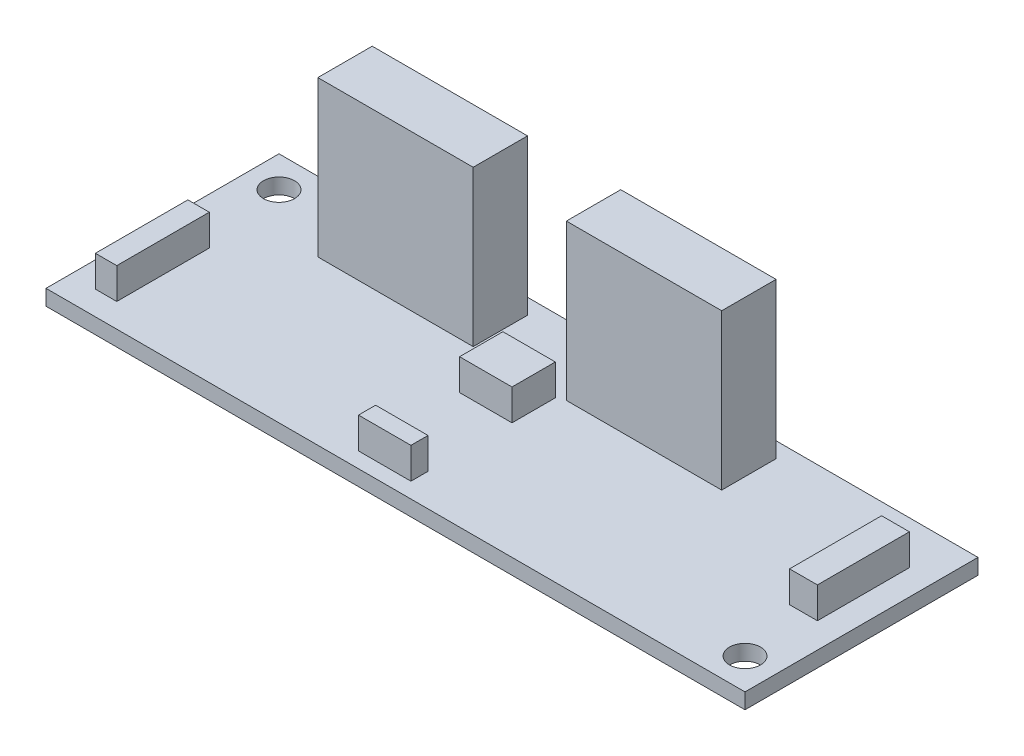
ISO-10303-21;
HEADER;
FILE_DESCRIPTION(('STEP AP214'),'2;1');
FILE_NAME('part.step','',(''),(''),'','','');
FILE_SCHEMA(('AUTOMOTIVE_DESIGN { 1 0 10303 214 1 1 1 1 }'));
ENDSEC;
DATA;
#1=APPLICATION_CONTEXT('core data for automotive mechanical design processes');
#2=APPLICATION_PROTOCOL_DEFINITION('international standard','automotive_design',2000,#1);
#3=PRODUCT_CONTEXT('',#1,'mechanical');
#4=PRODUCT('Part','Part','',(#3));
#5=PRODUCT_RELATED_PRODUCT_CATEGORY('part','',(#4));
#6=PRODUCT_DEFINITION_FORMATION('','',#4);
#7=PRODUCT_DEFINITION_CONTEXT('part definition',#1,'design');
#8=PRODUCT_DEFINITION('design','',#6,#7);
#9=PRODUCT_DEFINITION_SHAPE('','',#8);
#10=(LENGTH_UNIT() NAMED_UNIT(*) SI_UNIT(.MILLI.,.METRE.));
#11=(NAMED_UNIT(*) PLANE_ANGLE_UNIT() SI_UNIT($,.RADIAN.));
#12=(NAMED_UNIT(*) SI_UNIT($,.STERADIAN.) SOLID_ANGLE_UNIT());
#13=UNCERTAINTY_MEASURE_WITH_UNIT(LENGTH_MEASURE(1.E-05),#10,'distance_accuracy_value','');
#14=(GEOMETRIC_REPRESENTATION_CONTEXT(3) GLOBAL_UNCERTAINTY_ASSIGNED_CONTEXT((#13)) GLOBAL_UNIT_ASSIGNED_CONTEXT((#10,
#11,#12)) REPRESENTATION_CONTEXT('',''));
#15=CARTESIAN_POINT('',(0.,0.,0.));
#16=DIRECTION('',(0.,0.,1.));
#17=DIRECTION('',(1.,0.,0.));
#18=AXIS2_PLACEMENT_3D('',#15,#16,#17);
#19=CARTESIAN_POINT('',(0.,0.5,0.));
#20=DIRECTION('',(0.,-1.,0.));
#21=DIRECTION('',(0.,0.,-1.));
#22=AXIS2_PLACEMENT_3D('',#19,#20,#21);
#23=PLANE('',#22);
#24=DIRECTION('',(0.,0.,1.));
#25=VECTOR('',#24,1.);
#26=CARTESIAN_POINT('',(-3.37429043222979,0.5,5.40575099857224));
#27=LINE('',#26,#25);
#28=CARTESIAN_POINT('',(-3.37429043222979,0.5,5.40575099857224));
#29=VERTEX_POINT('',#28);
#30=CARTESIAN_POINT('',(-3.37429043222979,0.5,6.50756011930034));
#31=VERTEX_POINT('',#30);
#32=EDGE_CURVE('E238',#29,#31,#27,.T.);
#33=ORIENTED_EDGE('',*,*,#32,.F.);
#34=DIRECTION('',(-1.,0.,0.));
#35=VECTOR('',#34,1.);
#36=CARTESIAN_POINT('',(-3.37429043222979,0.5,5.40575099857224));
#37=LINE('',#36,#35);
#38=CARTESIAN_POINT('',(0.,0.5,5.40575099857224));
#39=VERTEX_POINT('',#38);
#40=EDGE_CURVE('E251',#39,#29,#37,.T.);
#41=ORIENTED_EDGE('',*,*,#40,.F.);
#42=DIRECTION('',(0.,0.,-1.));
#43=VECTOR('',#42,1.);
#44=CARTESIAN_POINT('',(0.,0.5,5.40575099857224));
#45=LINE('',#44,#43);
#46=CARTESIAN_POINT('',(0.,0.5,6.50756011930034));
#47=VERTEX_POINT('',#46);
#48=EDGE_CURVE('E260',#47,#39,#45,.T.);
#49=ORIENTED_EDGE('',*,*,#48,.F.);
#50=DIRECTION('',(1.,0.,0.));
#51=VECTOR('',#50,1.);
#52=CARTESIAN_POINT('',(-3.37429043222979,0.5,6.50756011930034));
#53=LINE('',#52,#51);
#54=EDGE_CURVE('E241',#31,#47,#53,.T.);
#55=ORIENTED_EDGE('',*,*,#54,.F.);
#56=EDGE_LOOP('',(#33,#41,#49,#55));
#57=FACE_BOUND('',#56,.T.);
#58=DIRECTION('',(0.,0.,1.));
#59=VECTOR('',#58,1.);
#60=CARTESIAN_POINT('',(-3.37429043222979,0.5,-2.78895433684296));
#61=LINE('',#60,#59);
#62=CARTESIAN_POINT('',(-3.37429043222979,0.5,-2.78895433684296));
#63=VERTEX_POINT('',#62);
#64=CARTESIAN_POINT('',(-3.37429043222979,0.5,0.));
#65=VERTEX_POINT('',#64);
#66=EDGE_CURVE('E309',#63,#65,#61,.T.);
#67=ORIENTED_EDGE('',*,*,#66,.F.);
#68=DIRECTION('',(-1.,0.,0.));
#69=VECTOR('',#68,1.);
#70=CARTESIAN_POINT('',(-3.37429043222979,0.5,-2.78895433684296));
#71=LINE('',#70,#69);
#72=CARTESIAN_POINT('',(0.,0.5,-2.78895433684296));
#73=VERTEX_POINT('',#72);
#74=EDGE_CURVE('E314',#73,#63,#71,.T.);
#75=ORIENTED_EDGE('',*,*,#74,.F.);
#76=DIRECTION('',(0.,0.,-1.));
#77=VECTOR('',#76,1.);
#78=CARTESIAN_POINT('',(0.,0.5,-2.78895433684296));
#79=LINE('',#78,#77);
#80=CARTESIAN_POINT('',(0.,0.5,0.));
#81=VERTEX_POINT('',#80);
#82=EDGE_CURVE('E326',#81,#73,#79,.T.);
#83=ORIENTED_EDGE('',*,*,#82,.F.);
#84=DIRECTION('',(1.,0.,0.));
#85=VECTOR('',#84,1.);
#86=CARTESIAN_POINT('',(-3.37429043222979,0.5,0.));
#87=LINE('',#86,#85);
#88=EDGE_CURVE('E323',#65,#81,#87,.T.);
#89=ORIENTED_EDGE('',*,*,#88,.F.);
#90=EDGE_LOOP('',(#67,#75,#83,#89));
#91=FACE_BOUND('',#90,.T.);
#92=DIRECTION('',(0.,0.,1.));
#93=VECTOR('',#92,1.);
#94=CARTESIAN_POINT('',(-15.5,0.5,-6.5));
#95=LINE('',#94,#93);
#96=CARTESIAN_POINT('',(-15.5,0.5,-6.5));
#97=VERTEX_POINT('',#96);
#98=CARTESIAN_POINT('',(-15.5,0.5,-3.));
#99=VERTEX_POINT('',#98);
#100=EDGE_CURVE('E375',#97,#99,#95,.T.);
#101=ORIENTED_EDGE('',*,*,#100,.F.);
#102=DIRECTION('',(-1.,0.,0.));
#103=VECTOR('',#102,1.);
#104=CARTESIAN_POINT('',(-15.5,0.5,-6.5));
#105=LINE('',#104,#103);
#106=CARTESIAN_POINT('',(-5.5,0.5,-6.5));
#107=VERTEX_POINT('',#106);
#108=EDGE_CURVE('E380',#107,#97,#105,.T.);
#109=ORIENTED_EDGE('',*,*,#108,.F.);
#110=DIRECTION('',(0.,0.,-1.));
#111=VECTOR('',#110,1.);
#112=CARTESIAN_POINT('',(-5.5,0.5,-6.5));
#113=LINE('',#112,#111);
#114=CARTESIAN_POINT('',(-5.5,0.5,-3.));
#115=VERTEX_POINT('',#114);
#116=EDGE_CURVE('E392',#115,#107,#113,.T.);
#117=ORIENTED_EDGE('',*,*,#116,.F.);
#118=DIRECTION('',(1.,0.,0.));
#119=VECTOR('',#118,1.);
#120=CARTESIAN_POINT('',(-15.5,0.5,-3.));
#121=LINE('',#120,#119);
#122=EDGE_CURVE('E389',#99,#115,#121,.T.);
#123=ORIENTED_EDGE('',*,*,#122,.F.);
#124=EDGE_LOOP('',(#101,#109,#117,#123));
#125=FACE_BOUND('',#124,.T.);
#126=DIRECTION('',(0.,0.,-1.));
#127=VECTOR('',#126,1.);
#128=CARTESIAN_POINT('',(22.5,0.5,7.5));
#129=LINE('',#128,#127);
#130=CARTESIAN_POINT('',(22.5,0.5,7.5));
#131=VERTEX_POINT('',#130);
#132=CARTESIAN_POINT('',(22.5,0.5,-7.5));
#133=VERTEX_POINT('',#132);
#134=EDGE_CURVE('E421',#131,#133,#129,.T.);
#135=ORIENTED_EDGE('',*,*,#134,.T.);
#136=DIRECTION('',(-1.,0.,0.));
#137=VECTOR('',#136,1.);
#138=CARTESIAN_POINT('',(-22.5,0.5,-7.5));
#139=LINE('',#138,#137);
#140=CARTESIAN_POINT('',(-22.5,0.5,-7.5));
#141=VERTEX_POINT('',#140);
#142=EDGE_CURVE('E424',#133,#141,#139,.T.);
#143=ORIENTED_EDGE('',*,*,#142,.T.);
#144=DIRECTION('',(0.,0.,1.));
#145=VECTOR('',#144,1.);
#146=CARTESIAN_POINT('',(-22.5,0.5,7.5));
#147=LINE('',#146,#145);
#148=CARTESIAN_POINT('',(-22.5,0.5,7.5));
#149=VERTEX_POINT('',#148);
#150=EDGE_CURVE('E427',#141,#149,#147,.T.);
#151=ORIENTED_EDGE('',*,*,#150,.T.);
#152=DIRECTION('',(1.,0.,0.));
#153=VECTOR('',#152,1.);
#154=CARTESIAN_POINT('',(-22.5,0.5,7.5));
#155=LINE('',#154,#153);
#156=EDGE_CURVE('E429',#149,#131,#155,.T.);
#157=ORIENTED_EDGE('',*,*,#156,.T.);
#158=EDGE_LOOP('',(#135,#143,#151,#157));
#159=FACE_BOUND('',#158,.T.);
#160=CARTESIAN_POINT('',(-20.5,0.5,-5.5));
#161=DIRECTION('',(0.,1.,0.));
#162=DIRECTION('',(0.,0.,1.));
#163=AXIS2_PLACEMENT_3D('',#160,#161,#162);
#164=CIRCLE('',#163,1.);
#165=CARTESIAN_POINT('',(-20.5,0.5,-4.5));
#166=VERTEX_POINT('',#165);
#167=EDGE_CURVE('E415',#166,#166,#164,.T.);
#168=ORIENTED_EDGE('',*,*,#167,.F.);
#169=EDGE_LOOP('',(#168));
#170=FACE_BOUND('',#169,.T.);
#171=CARTESIAN_POINT('',(20.5,0.5,5.5));
#172=DIRECTION('',(0.,1.,0.));
#173=DIRECTION('',(0.,0.,1.));
#174=AXIS2_PLACEMENT_3D('',#171,#172,#173);
#175=CIRCLE('',#174,1.);
#176=CARTESIAN_POINT('',(20.5,0.5,6.5));
#177=VERTEX_POINT('',#176);
#178=EDGE_CURVE('E409',#177,#177,#175,.T.);
#179=ORIENTED_EDGE('',*,*,#178,.F.);
#180=EDGE_LOOP('',(#179));
#181=FACE_BOUND('',#180,.T.);
#182=DIRECTION('',(0.,0.,1.));
#183=VECTOR('',#182,1.);
#184=CARTESIAN_POINT('',(0.500000000000004,0.5,-6.5));
#185=LINE('',#184,#183);
#186=CARTESIAN_POINT('',(0.500000000000004,0.5,-6.5));
#187=VERTEX_POINT('',#186);
#188=CARTESIAN_POINT('',(0.500000000000004,0.5,-3.));
#189=VERTEX_POINT('',#188);
#190=EDGE_CURVE('E342',#187,#189,#185,.T.);
#191=ORIENTED_EDGE('',*,*,#190,.F.);
#192=DIRECTION('',(-1.,0.,0.));
#193=VECTOR('',#192,1.);
#194=CARTESIAN_POINT('',(0.500000000000004,0.5,-6.5));
#195=LINE('',#194,#193);
#196=CARTESIAN_POINT('',(10.5,0.5,-6.5));
#197=VERTEX_POINT('',#196);
#198=EDGE_CURVE('E347',#197,#187,#195,.T.);
#199=ORIENTED_EDGE('',*,*,#198,.F.);
#200=DIRECTION('',(0.,0.,-1.));
#201=VECTOR('',#200,1.);
#202=CARTESIAN_POINT('',(10.5,0.5,-6.5));
#203=LINE('',#202,#201);
#204=CARTESIAN_POINT('',(10.5,0.5,-3.));
#205=VERTEX_POINT('',#204);
#206=EDGE_CURVE('E359',#205,#197,#203,.T.);
#207=ORIENTED_EDGE('',*,*,#206,.F.);
#208=DIRECTION('',(1.,0.,0.));
#209=VECTOR('',#208,1.);
#210=CARTESIAN_POINT('',(0.500000000000004,0.5,-3.));
#211=LINE('',#210,#209);
#212=EDGE_CURVE('E356',#189,#205,#211,.T.);
#213=ORIENTED_EDGE('',*,*,#212,.F.);
#214=EDGE_LOOP('',(#191,#199,#207,#213));
#215=FACE_BOUND('',#214,.T.);
#216=DIRECTION('',(0.,0.,1.));
#217=VECTOR('',#216,1.);
#218=CARTESIAN_POINT('',(-20.8655102237883,0.5,0.));
#219=LINE('',#218,#217);
#220=CARTESIAN_POINT('',(-20.8655102237883,0.5,0.));
#221=VERTEX_POINT('',#220);
#222=CARTESIAN_POINT('',(-20.8655102237883,0.5,5.95665555893629));
#223=VERTEX_POINT('',#222);
#224=EDGE_CURVE('E276',#221,#223,#219,.T.);
#225=ORIENTED_EDGE('',*,*,#224,.F.);
#226=DIRECTION('',(-1.,0.,0.));
#227=VECTOR('',#226,1.);
#228=CARTESIAN_POINT('',(-20.8655102237883,0.5,0.));
#229=LINE('',#228,#227);
#230=CARTESIAN_POINT('',(-19.4882488228782,0.5,0.));
#231=VERTEX_POINT('',#230);
#232=EDGE_CURVE('E281',#231,#221,#229,.T.);
#233=ORIENTED_EDGE('',*,*,#232,.F.);
#234=DIRECTION('',(0.,0.,-1.));
#235=VECTOR('',#234,1.);
#236=CARTESIAN_POINT('',(-19.4882488228782,0.5,0.));
#237=LINE('',#236,#235);
#238=CARTESIAN_POINT('',(-19.4882488228782,0.5,5.95665555893629));
#239=VERTEX_POINT('',#238);
#240=EDGE_CURVE('E293',#239,#231,#237,.T.);
#241=ORIENTED_EDGE('',*,*,#240,.F.);
#242=DIRECTION('',(1.,0.,0.));
#243=VECTOR('',#242,1.);
#244=CARTESIAN_POINT('',(-20.8655102237883,0.5,5.95665555893629));
#245=LINE('',#244,#243);
#246=EDGE_CURVE('E290',#223,#239,#245,.T.);
#247=ORIENTED_EDGE('',*,*,#246,.F.);
#248=EDGE_LOOP('',(#225,#233,#241,#247));
#249=FACE_BOUND('',#248,.T.);
#250=DIRECTION('',(0.,0.,1.));
#251=VECTOR('',#250,1.);
#252=CARTESIAN_POINT('',(19.0750704026051,0.5,-4.71712029811712));
#253=LINE('',#252,#251);
#254=CARTESIAN_POINT('',(19.0750704026051,0.5,-4.71712029811712));
#255=VERTEX_POINT('',#254);
#256=CARTESIAN_POINT('',(19.0750704026051,0.5,1.20510372579638));
#257=VERTEX_POINT('',#256);
#258=EDGE_CURVE('E237',#255,#257,#253,.T.);
#259=ORIENTED_EDGE('',*,*,#258,.F.);
#260=DIRECTION('',(-1.,0.,0.));
#261=VECTOR('',#260,1.);
#262=CARTESIAN_POINT('',(19.0750704026051,0.5,-4.71712029811712));
#263=LINE('',#262,#261);
#264=CARTESIAN_POINT('',(20.8655102237883,0.5,-4.71712029811712));
#265=VERTEX_POINT('',#264);
#266=EDGE_CURVE('E234',#265,#255,#263,.T.);
#267=ORIENTED_EDGE('',*,*,#266,.F.);
#268=DIRECTION('',(0.,0.,-1.));
#269=VECTOR('',#268,1.);
#270=CARTESIAN_POINT('',(20.8655102237883,0.5,-4.71712029811712));
#271=LINE('',#270,#269);
#272=CARTESIAN_POINT('',(20.8655102237883,0.5,1.20510372579638));
#273=VERTEX_POINT('',#272);
#274=EDGE_CURVE('E52',#273,#265,#271,.T.);
#275=ORIENTED_EDGE('',*,*,#274,.F.);
#276=DIRECTION('',(1.,0.,0.));
#277=VECTOR('',#276,1.);
#278=CARTESIAN_POINT('',(19.0750704026051,0.5,1.20510372579638));
#279=LINE('',#278,#277);
#280=EDGE_CURVE('E47',#257,#273,#279,.T.);
#281=ORIENTED_EDGE('',*,*,#280,.F.);
#282=EDGE_LOOP('',(#259,#267,#275,#281));
#283=FACE_BOUND('',#282,.T.);
#284=ADVANCED_FACE('F32',(#57,#91,#125,#159,#170,#181,#215,#249,#283),#23,.F.);
#285=CARTESIAN_POINT('',(0.,-0.5,0.));
#286=DIRECTION('',(0.,-1.,0.));
#287=DIRECTION('',(0.,0.,-1.));
#288=AXIS2_PLACEMENT_3D('',#285,#286,#287);
#289=PLANE('',#288);
#290=CARTESIAN_POINT('',(-20.5,-0.5,-5.5));
#291=DIRECTION('',(0.,1.,0.));
#292=DIRECTION('',(0.,0.,1.));
#293=AXIS2_PLACEMENT_3D('',#290,#291,#292);
#294=CIRCLE('',#293,1.);
#295=CARTESIAN_POINT('',(-20.5,-0.5,-4.5));
#296=VERTEX_POINT('',#295);
#297=EDGE_CURVE('E412',#296,#296,#294,.T.);
#298=ORIENTED_EDGE('',*,*,#297,.T.);
#299=EDGE_LOOP('',(#298));
#300=FACE_BOUND('',#299,.T.);
#301=DIRECTION('',(0.,0.,-1.));
#302=VECTOR('',#301,1.);
#303=CARTESIAN_POINT('',(22.5,-0.5,7.5));
#304=LINE('',#303,#302);
#305=CARTESIAN_POINT('',(22.5,-0.5,7.5));
#306=VERTEX_POINT('',#305);
#307=CARTESIAN_POINT('',(22.5,-0.5,-7.5));
#308=VERTEX_POINT('',#307);
#309=EDGE_CURVE('E418',#306,#308,#304,.T.);
#310=ORIENTED_EDGE('',*,*,#309,.F.);
#311=DIRECTION('',(1.,0.,0.));
#312=VECTOR('',#311,1.);
#313=CARTESIAN_POINT('',(-22.5,-0.5,7.5));
#314=LINE('',#313,#312);
#315=CARTESIAN_POINT('',(-22.5,-0.5,7.5));
#316=VERTEX_POINT('',#315);
#317=EDGE_CURVE('E425',#316,#306,#314,.T.);
#318=ORIENTED_EDGE('',*,*,#317,.F.);
#319=DIRECTION('',(0.,0.,1.));
#320=VECTOR('',#319,1.);
#321=CARTESIAN_POINT('',(-22.5,-0.5,7.5));
#322=LINE('',#321,#320);
#323=CARTESIAN_POINT('',(-22.5,-0.5,-7.5));
#324=VERTEX_POINT('',#323);
#325=EDGE_CURVE('E436',#324,#316,#322,.T.);
#326=ORIENTED_EDGE('',*,*,#325,.F.);
#327=DIRECTION('',(-1.,0.,0.));
#328=VECTOR('',#327,1.);
#329=CARTESIAN_POINT('',(-22.5,-0.5,-7.5));
#330=LINE('',#329,#328);
#331=EDGE_CURVE('E434',#308,#324,#330,.T.);
#332=ORIENTED_EDGE('',*,*,#331,.F.);
#333=EDGE_LOOP('',(#310,#318,#326,#332));
#334=FACE_BOUND('',#333,.T.);
#335=CARTESIAN_POINT('',(20.5,-0.5,5.5));
#336=DIRECTION('',(0.,1.,0.));
#337=DIRECTION('',(0.,0.,1.));
#338=AXIS2_PLACEMENT_3D('',#335,#336,#337);
#339=CIRCLE('',#338,1.);
#340=CARTESIAN_POINT('',(20.5,-0.5,6.5));
#341=VERTEX_POINT('',#340);
#342=EDGE_CURVE('E408',#341,#341,#339,.T.);
#343=ORIENTED_EDGE('',*,*,#342,.T.);
#344=EDGE_LOOP('',(#343));
#345=FACE_BOUND('',#344,.T.);
#346=ADVANCED_FACE('F454',(#300,#334,#345),#289,.T.);
#347=CARTESIAN_POINT('',(22.5,0.5,7.5));
#348=DIRECTION('',(-1.,0.,0.));
#349=DIRECTION('',(0.,0.,1.));
#350=AXIS2_PLACEMENT_3D('',#347,#348,#349);
#351=PLANE('',#350);
#352=ORIENTED_EDGE('',*,*,#309,.T.);
#353=DIRECTION('',(0.,-1.,0.));
#354=VECTOR('',#353,1.);
#355=CARTESIAN_POINT('',(22.5,0.5,-7.5));
#356=LINE('',#355,#354);
#357=EDGE_CURVE('E11',#133,#308,#356,.T.);
#358=ORIENTED_EDGE('',*,*,#357,.F.);
#359=ORIENTED_EDGE('',*,*,#134,.F.);
#360=DIRECTION('',(0.,-1.,0.));
#361=VECTOR('',#360,1.);
#362=CARTESIAN_POINT('',(22.5,0.5,7.5));
#363=LINE('',#362,#361);
#364=EDGE_CURVE('E431',#131,#306,#363,.T.);
#365=ORIENTED_EDGE('',*,*,#364,.T.);
#366=EDGE_LOOP('',(#352,#358,#359,#365));
#367=FACE_BOUND('',#366,.T.);
#368=ADVANCED_FACE('F34',(#367),#351,.F.);
#369=CARTESIAN_POINT('',(-22.5,0.5,-7.5));
#370=DIRECTION('',(0.,0.,1.));
#371=DIRECTION('',(1.,0.,0.));
#372=AXIS2_PLACEMENT_3D('',#369,#370,#371);
#373=PLANE('',#372);
#374=ORIENTED_EDGE('',*,*,#331,.T.);
#375=DIRECTION('',(0.,-1.,0.));
#376=VECTOR('',#375,1.);
#377=CARTESIAN_POINT('',(-22.5,0.5,-7.5));
#378=LINE('',#377,#376);
#379=EDGE_CURVE('E40',#141,#324,#378,.T.);
#380=ORIENTED_EDGE('',*,*,#379,.F.);
#381=ORIENTED_EDGE('',*,*,#142,.F.);
#382=ORIENTED_EDGE('',*,*,#357,.T.);
#383=EDGE_LOOP('',(#374,#380,#381,#382));
#384=FACE_BOUND('',#383,.T.);
#385=ADVANCED_FACE('F465',(#384),#373,.F.);
#386=CARTESIAN_POINT('',(-22.5,0.5,7.5));
#387=DIRECTION('',(1.,0.,0.));
#388=DIRECTION('',(0.,0.,-1.));
#389=AXIS2_PLACEMENT_3D('',#386,#387,#388);
#390=PLANE('',#389);
#391=ORIENTED_EDGE('',*,*,#325,.T.);
#392=DIRECTION('',(0.,-1.,0.));
#393=VECTOR('',#392,1.);
#394=CARTESIAN_POINT('',(-22.5,0.5,7.5));
#395=LINE('',#394,#393);
#396=EDGE_CURVE('E441',#149,#316,#395,.T.);
#397=ORIENTED_EDGE('',*,*,#396,.F.);
#398=ORIENTED_EDGE('',*,*,#150,.F.);
#399=ORIENTED_EDGE('',*,*,#379,.T.);
#400=EDGE_LOOP('',(#391,#397,#398,#399));
#401=FACE_BOUND('',#400,.T.);
#402=ADVANCED_FACE('F448',(#401),#390,.F.);
#403=CARTESIAN_POINT('',(-22.5,0.5,7.5));
#404=DIRECTION('',(0.,0.,-1.));
#405=DIRECTION('',(-1.,0.,0.));
#406=AXIS2_PLACEMENT_3D('',#403,#404,#405);
#407=PLANE('',#406);
#408=ORIENTED_EDGE('',*,*,#317,.T.);
#409=ORIENTED_EDGE('',*,*,#364,.F.);
#410=ORIENTED_EDGE('',*,*,#156,.F.);
#411=ORIENTED_EDGE('',*,*,#396,.T.);
#412=EDGE_LOOP('',(#408,#409,#410,#411));
#413=FACE_BOUND('',#412,.T.);
#414=ADVANCED_FACE('F458',(#413),#407,.F.);
#415=CARTESIAN_POINT('',(-20.5,0.5,-5.5));
#416=DIRECTION('',(0.,-1.,0.));
#417=DIRECTION('',(0.,0.,-1.));
#418=AXIS2_PLACEMENT_3D('',#415,#416,#417);
#419=CYLINDRICAL_SURFACE('',#418,1.);
#420=ORIENTED_EDGE('',*,*,#167,.T.);
#421=EDGE_LOOP('',(#420));
#422=FACE_BOUND('',#421,.T.);
#423=ORIENTED_EDGE('',*,*,#297,.F.);
#424=EDGE_LOOP('',(#423));
#425=FACE_BOUND('',#424,.T.);
#426=ADVANCED_FACE('F482',(#422,#425),#419,.F.);
#427=CARTESIAN_POINT('',(20.5,0.5,5.5));
#428=DIRECTION('',(0.,-1.,0.));
#429=DIRECTION('',(0.,0.,-1.));
#430=AXIS2_PLACEMENT_3D('',#427,#428,#429);
#431=CYLINDRICAL_SURFACE('',#430,1.);
#432=ORIENTED_EDGE('',*,*,#178,.T.);
#433=EDGE_LOOP('',(#432));
#434=FACE_BOUND('',#433,.T.);
#435=ORIENTED_EDGE('',*,*,#342,.F.);
#436=EDGE_LOOP('',(#435));
#437=FACE_BOUND('',#436,.T.);
#438=ADVANCED_FACE('F489',(#434,#437),#431,.F.);
#439=CARTESIAN_POINT('',(-15.5,10.5,-6.5));
#440=DIRECTION('',(1.,0.,0.));
#441=DIRECTION('',(0.,0.,-1.));
#442=AXIS2_PLACEMENT_3D('',#439,#440,#441);
#443=PLANE('',#442);
#444=ORIENTED_EDGE('',*,*,#100,.T.);
#445=DIRECTION('',(0.,-1.,0.));
#446=VECTOR('',#445,1.);
#447=CARTESIAN_POINT('',(-15.5,10.5,-3.));
#448=LINE('',#447,#446);
#449=CARTESIAN_POINT('',(-15.5,10.5,-3.));
#450=VERTEX_POINT('',#449);
#451=EDGE_CURVE('E405',#450,#99,#448,.T.);
#452=ORIENTED_EDGE('',*,*,#451,.F.);
#453=DIRECTION('',(0.,0.,1.));
#454=VECTOR('',#453,1.);
#455=CARTESIAN_POINT('',(-15.5,10.5,-6.5));
#456=LINE('',#455,#454);
#457=CARTESIAN_POINT('',(-15.5,10.5,-6.5));
#458=VERTEX_POINT('',#457);
#459=EDGE_CURVE('E376',#458,#450,#456,.T.);
#460=ORIENTED_EDGE('',*,*,#459,.F.);
#461=DIRECTION('',(0.,-1.,0.));
#462=VECTOR('',#461,1.);
#463=CARTESIAN_POINT('',(-15.5,10.5,-6.5));
#464=LINE('',#463,#462);
#465=EDGE_CURVE('E386',#458,#97,#464,.T.);
#466=ORIENTED_EDGE('',*,*,#465,.T.);
#467=EDGE_LOOP('',(#444,#452,#460,#466));
#468=FACE_BOUND('',#467,.T.);
#469=ADVANCED_FACE('F494',(#468),#443,.F.);
#470=CARTESIAN_POINT('',(-15.5,10.5,-3.));
#471=DIRECTION('',(0.,0.,-1.));
#472=DIRECTION('',(-1.,0.,0.));
#473=AXIS2_PLACEMENT_3D('',#470,#471,#472);
#474=PLANE('',#473);
#475=ORIENTED_EDGE('',*,*,#122,.T.);
#476=DIRECTION('',(0.,-1.,0.));
#477=VECTOR('',#476,1.);
#478=CARTESIAN_POINT('',(-5.5,10.5,-3.));
#479=LINE('',#478,#477);
#480=CARTESIAN_POINT('',(-5.5,10.5,-3.));
#481=VERTEX_POINT('',#480);
#482=EDGE_CURVE('E402',#481,#115,#479,.T.);
#483=ORIENTED_EDGE('',*,*,#482,.F.);
#484=DIRECTION('',(1.,0.,0.));
#485=VECTOR('',#484,1.);
#486=CARTESIAN_POINT('',(-15.5,10.5,-3.));
#487=LINE('',#486,#485);
#488=EDGE_CURVE('E379',#450,#481,#487,.T.);
#489=ORIENTED_EDGE('',*,*,#488,.F.);
#490=ORIENTED_EDGE('',*,*,#451,.T.);
#491=EDGE_LOOP('',(#475,#483,#489,#490));
#492=FACE_BOUND('',#491,.T.);
#493=ADVANCED_FACE('F621',(#492),#474,.F.);
#494=CARTESIAN_POINT('',(-5.5,10.5,-6.5));
#495=DIRECTION('',(-1.,0.,0.));
#496=DIRECTION('',(0.,0.,1.));
#497=AXIS2_PLACEMENT_3D('',#494,#495,#496);
#498=PLANE('',#497);
#499=ORIENTED_EDGE('',*,*,#116,.T.);
#500=DIRECTION('',(0.,-1.,0.));
#501=VECTOR('',#500,1.);
#502=CARTESIAN_POINT('',(-5.5,10.5,-6.5));
#503=LINE('',#502,#501);
#504=CARTESIAN_POINT('',(-5.5,10.5,-6.5));
#505=VERTEX_POINT('',#504);
#506=EDGE_CURVE('E399',#505,#107,#503,.T.);
#507=ORIENTED_EDGE('',*,*,#506,.F.);
#508=DIRECTION('',(0.,0.,-1.));
#509=VECTOR('',#508,1.);
#510=CARTESIAN_POINT('',(-5.5,10.5,-6.5));
#511=LINE('',#510,#509);
#512=EDGE_CURVE('E382',#481,#505,#511,.T.);
#513=ORIENTED_EDGE('',*,*,#512,.F.);
#514=ORIENTED_EDGE('',*,*,#482,.T.);
#515=EDGE_LOOP('',(#499,#507,#513,#514));
#516=FACE_BOUND('',#515,.T.);
#517=ADVANCED_FACE('F617',(#516),#498,.F.);
#518=CARTESIAN_POINT('',(-15.5,10.5,-6.5));
#519=DIRECTION('',(0.,0.,1.));
#520=DIRECTION('',(1.,0.,0.));
#521=AXIS2_PLACEMENT_3D('',#518,#519,#520);
#522=PLANE('',#521);
#523=ORIENTED_EDGE('',*,*,#108,.T.);
#524=ORIENTED_EDGE('',*,*,#465,.F.);
#525=DIRECTION('',(-1.,0.,0.));
#526=VECTOR('',#525,1.);
#527=CARTESIAN_POINT('',(-15.5,10.5,-6.5));
#528=LINE('',#527,#526);
#529=EDGE_CURVE('E384',#505,#458,#528,.T.);
#530=ORIENTED_EDGE('',*,*,#529,.F.);
#531=ORIENTED_EDGE('',*,*,#506,.T.);
#532=EDGE_LOOP('',(#523,#524,#530,#531));
#533=FACE_BOUND('',#532,.T.);
#534=ADVANCED_FACE('F613',(#533),#522,.F.);
#535=CARTESIAN_POINT('',(0.,10.5,0.));
#536=DIRECTION('',(0.,1.,0.));
#537=DIRECTION('',(0.,0.,1.));
#538=AXIS2_PLACEMENT_3D('',#535,#536,#537);
#539=PLANE('',#538);
#540=ORIENTED_EDGE('',*,*,#459,.T.);
#541=ORIENTED_EDGE('',*,*,#488,.T.);
#542=ORIENTED_EDGE('',*,*,#512,.T.);
#543=ORIENTED_EDGE('',*,*,#529,.T.);
#544=EDGE_LOOP('',(#540,#541,#542,#543));
#545=FACE_BOUND('',#544,.T.);
#546=ADVANCED_FACE('F609',(#545),#539,.T.);
#547=CARTESIAN_POINT('',(0.500000000000004,10.5,-6.5));
#548=DIRECTION('',(1.,0.,0.));
#549=DIRECTION('',(0.,0.,-1.));
#550=AXIS2_PLACEMENT_3D('',#547,#548,#549);
#551=PLANE('',#550);
#552=ORIENTED_EDGE('',*,*,#190,.T.);
#553=DIRECTION('',(0.,-1.,0.));
#554=VECTOR('',#553,1.);
#555=CARTESIAN_POINT('',(0.500000000000004,10.5,-3.));
#556=LINE('',#555,#554);
#557=CARTESIAN_POINT('',(0.500000000000004,10.5,-3.));
#558=VERTEX_POINT('',#557);
#559=EDGE_CURVE('E372',#558,#189,#556,.T.);
#560=ORIENTED_EDGE('',*,*,#559,.F.);
#561=DIRECTION('',(0.,0.,1.));
#562=VECTOR('',#561,1.);
#563=CARTESIAN_POINT('',(0.500000000000004,10.5,-6.5));
#564=LINE('',#563,#562);
#565=CARTESIAN_POINT('',(0.500000000000004,10.5,-6.5));
#566=VERTEX_POINT('',#565);
#567=EDGE_CURVE('E343',#566,#558,#564,.T.);
#568=ORIENTED_EDGE('',*,*,#567,.F.);
#569=DIRECTION('',(0.,-1.,0.));
#570=VECTOR('',#569,1.);
#571=CARTESIAN_POINT('',(0.500000000000004,10.5,-6.5));
#572=LINE('',#571,#570);
#573=EDGE_CURVE('E353',#566,#187,#572,.T.);
#574=ORIENTED_EDGE('',*,*,#573,.T.);
#575=EDGE_LOOP('',(#552,#560,#568,#574));
#576=FACE_BOUND('',#575,.T.);
#577=ADVANCED_FACE('F605',(#576),#551,.F.);
#578=CARTESIAN_POINT('',(0.500000000000004,10.5,-3.));
#579=DIRECTION('',(0.,0.,-1.));
#580=DIRECTION('',(-1.,0.,0.));
#581=AXIS2_PLACEMENT_3D('',#578,#579,#580);
#582=PLANE('',#581);
#583=ORIENTED_EDGE('',*,*,#212,.T.);
#584=DIRECTION('',(0.,-1.,0.));
#585=VECTOR('',#584,1.);
#586=CARTESIAN_POINT('',(10.5,10.5,-3.));
#587=LINE('',#586,#585);
#588=CARTESIAN_POINT('',(10.5,10.5,-3.));
#589=VERTEX_POINT('',#588);
#590=EDGE_CURVE('E369',#589,#205,#587,.T.);
#591=ORIENTED_EDGE('',*,*,#590,.F.);
#592=DIRECTION('',(1.,0.,0.));
#593=VECTOR('',#592,1.);
#594=CARTESIAN_POINT('',(0.500000000000004,10.5,-3.));
#595=LINE('',#594,#593);
#596=EDGE_CURVE('E346',#558,#589,#595,.T.);
#597=ORIENTED_EDGE('',*,*,#596,.F.);
#598=ORIENTED_EDGE('',*,*,#559,.T.);
#599=EDGE_LOOP('',(#583,#591,#597,#598));
#600=FACE_BOUND('',#599,.T.);
#601=ADVANCED_FACE('F601',(#600),#582,.F.);
#602=CARTESIAN_POINT('',(10.5,10.5,-6.5));
#603=DIRECTION('',(-1.,0.,0.));
#604=DIRECTION('',(0.,0.,1.));
#605=AXIS2_PLACEMENT_3D('',#602,#603,#604);
#606=PLANE('',#605);
#607=ORIENTED_EDGE('',*,*,#206,.T.);
#608=DIRECTION('',(0.,-1.,0.));
#609=VECTOR('',#608,1.);
#610=CARTESIAN_POINT('',(10.5,10.5,-6.5));
#611=LINE('',#610,#609);
#612=CARTESIAN_POINT('',(10.5,10.5,-6.5));
#613=VERTEX_POINT('',#612);
#614=EDGE_CURVE('E366',#613,#197,#611,.T.);
#615=ORIENTED_EDGE('',*,*,#614,.F.);
#616=DIRECTION('',(0.,0.,-1.));
#617=VECTOR('',#616,1.);
#618=CARTESIAN_POINT('',(10.5,10.5,-6.5));
#619=LINE('',#618,#617);
#620=EDGE_CURVE('E349',#589,#613,#619,.T.);
#621=ORIENTED_EDGE('',*,*,#620,.F.);
#622=ORIENTED_EDGE('',*,*,#590,.T.);
#623=EDGE_LOOP('',(#607,#615,#621,#622));
#624=FACE_BOUND('',#623,.T.);
#625=ADVANCED_FACE('F597',(#624),#606,.F.);
#626=CARTESIAN_POINT('',(0.500000000000004,10.5,-6.5));
#627=DIRECTION('',(0.,0.,1.));
#628=DIRECTION('',(1.,0.,0.));
#629=AXIS2_PLACEMENT_3D('',#626,#627,#628);
#630=PLANE('',#629);
#631=ORIENTED_EDGE('',*,*,#198,.T.);
#632=ORIENTED_EDGE('',*,*,#573,.F.);
#633=DIRECTION('',(-1.,0.,0.));
#634=VECTOR('',#633,1.);
#635=CARTESIAN_POINT('',(0.500000000000004,10.5,-6.5));
#636=LINE('',#635,#634);
#637=EDGE_CURVE('E351',#613,#566,#636,.T.);
#638=ORIENTED_EDGE('',*,*,#637,.F.);
#639=ORIENTED_EDGE('',*,*,#614,.T.);
#640=EDGE_LOOP('',(#631,#632,#638,#639));
#641=FACE_BOUND('',#640,.T.);
#642=ADVANCED_FACE('F593',(#641),#630,.F.);
#643=CARTESIAN_POINT('',(0.,10.5,0.));
#644=DIRECTION('',(0.,1.,0.));
#645=DIRECTION('',(0.,0.,1.));
#646=AXIS2_PLACEMENT_3D('',#643,#644,#645);
#647=PLANE('',#646);
#648=ORIENTED_EDGE('',*,*,#567,.T.);
#649=ORIENTED_EDGE('',*,*,#596,.T.);
#650=ORIENTED_EDGE('',*,*,#620,.T.);
#651=ORIENTED_EDGE('',*,*,#637,.T.);
#652=EDGE_LOOP('',(#648,#649,#650,#651));
#653=FACE_BOUND('',#652,.T.);
#654=ADVANCED_FACE('F589',(#653),#647,.T.);
#655=CARTESIAN_POINT('',(-3.37429043222979,2.5,-2.78895433684296));
#656=DIRECTION('',(1.,0.,0.));
#657=DIRECTION('',(0.,0.,-1.));
#658=AXIS2_PLACEMENT_3D('',#655,#656,#657);
#659=PLANE('',#658);
#660=ORIENTED_EDGE('',*,*,#66,.T.);
#661=DIRECTION('',(0.,-1.,0.));
#662=VECTOR('',#661,1.);
#663=CARTESIAN_POINT('',(-3.37429043222979,2.5,0.));
#664=LINE('',#663,#662);
#665=CARTESIAN_POINT('',(-3.37429043222979,2.5,0.));
#666=VERTEX_POINT('',#665);
#667=EDGE_CURVE('E339',#666,#65,#664,.T.);
#668=ORIENTED_EDGE('',*,*,#667,.F.);
#669=DIRECTION('',(0.,0.,1.));
#670=VECTOR('',#669,1.);
#671=CARTESIAN_POINT('',(-3.37429043222979,2.5,-2.78895433684296));
#672=LINE('',#671,#670);
#673=CARTESIAN_POINT('',(-3.37429043222979,2.5,-2.78895433684296));
#674=VERTEX_POINT('',#673);
#675=EDGE_CURVE('E310',#674,#666,#672,.T.);
#676=ORIENTED_EDGE('',*,*,#675,.F.);
#677=DIRECTION('',(0.,-1.,0.));
#678=VECTOR('',#677,1.);
#679=CARTESIAN_POINT('',(-3.37429043222979,2.5,-2.78895433684296));
#680=LINE('',#679,#678);
#681=EDGE_CURVE('E320',#674,#63,#680,.T.);
#682=ORIENTED_EDGE('',*,*,#681,.T.);
#683=EDGE_LOOP('',(#660,#668,#676,#682));
#684=FACE_BOUND('',#683,.T.);
#685=ADVANCED_FACE('F585',(#684),#659,.F.);
#686=CARTESIAN_POINT('',(-3.37429043222979,2.5,0.));
#687=DIRECTION('',(0.,0.,-1.));
#688=DIRECTION('',(-1.,0.,0.));
#689=AXIS2_PLACEMENT_3D('',#686,#687,#688);
#690=PLANE('',#689);
#691=ORIENTED_EDGE('',*,*,#88,.T.);
#692=DIRECTION('',(0.,-1.,0.));
#693=VECTOR('',#692,1.);
#694=CARTESIAN_POINT('',(0.,2.5,0.));
#695=LINE('',#694,#693);
#696=CARTESIAN_POINT('',(0.,2.5,0.));
#697=VERTEX_POINT('',#696);
#698=EDGE_CURVE('E336',#697,#81,#695,.T.);
#699=ORIENTED_EDGE('',*,*,#698,.F.);
#700=DIRECTION('',(1.,0.,0.));
#701=VECTOR('',#700,1.);
#702=CARTESIAN_POINT('',(-3.37429043222979,2.5,0.));
#703=LINE('',#702,#701);
#704=EDGE_CURVE('E313',#666,#697,#703,.T.);
#705=ORIENTED_EDGE('',*,*,#704,.F.);
#706=ORIENTED_EDGE('',*,*,#667,.T.);
#707=EDGE_LOOP('',(#691,#699,#705,#706));
#708=FACE_BOUND('',#707,.T.);
#709=ADVANCED_FACE('F581',(#708),#690,.F.);
#710=CARTESIAN_POINT('',(0.,2.5,-2.78895433684296));
#711=DIRECTION('',(-1.,0.,0.));
#712=DIRECTION('',(0.,0.,1.));
#713=AXIS2_PLACEMENT_3D('',#710,#711,#712);
#714=PLANE('',#713);
#715=ORIENTED_EDGE('',*,*,#82,.T.);
#716=DIRECTION('',(0.,-1.,0.));
#717=VECTOR('',#716,1.);
#718=CARTESIAN_POINT('',(0.,2.5,-2.78895433684296));
#719=LINE('',#718,#717);
#720=CARTESIAN_POINT('',(0.,2.5,-2.78895433684296));
#721=VERTEX_POINT('',#720);
#722=EDGE_CURVE('E333',#721,#73,#719,.T.);
#723=ORIENTED_EDGE('',*,*,#722,.F.);
#724=DIRECTION('',(0.,0.,-1.));
#725=VECTOR('',#724,1.);
#726=CARTESIAN_POINT('',(0.,2.5,-2.78895433684296));
#727=LINE('',#726,#725);
#728=EDGE_CURVE('E316',#697,#721,#727,.T.);
#729=ORIENTED_EDGE('',*,*,#728,.F.);
#730=ORIENTED_EDGE('',*,*,#698,.T.);
#731=EDGE_LOOP('',(#715,#723,#729,#730));
#732=FACE_BOUND('',#731,.T.);
#733=ADVANCED_FACE('F577',(#732),#714,.F.);
#734=CARTESIAN_POINT('',(-3.37429043222979,2.5,-2.78895433684296));
#735=DIRECTION('',(0.,0.,1.));
#736=DIRECTION('',(1.,0.,0.));
#737=AXIS2_PLACEMENT_3D('',#734,#735,#736);
#738=PLANE('',#737);
#739=ORIENTED_EDGE('',*,*,#74,.T.);
#740=ORIENTED_EDGE('',*,*,#681,.F.);
#741=DIRECTION('',(-1.,0.,0.));
#742=VECTOR('',#741,1.);
#743=CARTESIAN_POINT('',(-3.37429043222979,2.5,-2.78895433684296));
#744=LINE('',#743,#742);
#745=EDGE_CURVE('E318',#721,#674,#744,.T.);
#746=ORIENTED_EDGE('',*,*,#745,.F.);
#747=ORIENTED_EDGE('',*,*,#722,.T.);
#748=EDGE_LOOP('',(#739,#740,#746,#747));
#749=FACE_BOUND('',#748,.T.);
#750=ADVANCED_FACE('F573',(#749),#738,.F.);
#751=CARTESIAN_POINT('',(0.,2.5,0.));
#752=DIRECTION('',(0.,1.,0.));
#753=DIRECTION('',(0.,0.,1.));
#754=AXIS2_PLACEMENT_3D('',#751,#752,#753);
#755=PLANE('',#754);
#756=ORIENTED_EDGE('',*,*,#675,.T.);
#757=ORIENTED_EDGE('',*,*,#704,.T.);
#758=ORIENTED_EDGE('',*,*,#728,.T.);
#759=ORIENTED_EDGE('',*,*,#745,.T.);
#760=EDGE_LOOP('',(#756,#757,#758,#759));
#761=FACE_BOUND('',#760,.T.);
#762=ADVANCED_FACE('F569',(#761),#755,.T.);
#763=CARTESIAN_POINT('',(-20.8655102237883,2.5,0.));
#764=DIRECTION('',(1.,0.,0.));
#765=DIRECTION('',(0.,0.,-1.));
#766=AXIS2_PLACEMENT_3D('',#763,#764,#765);
#767=PLANE('',#766);
#768=ORIENTED_EDGE('',*,*,#224,.T.);
#769=DIRECTION('',(0.,-1.,0.));
#770=VECTOR('',#769,1.);
#771=CARTESIAN_POINT('',(-20.8655102237883,2.5,5.95665555893629));
#772=LINE('',#771,#770);
#773=CARTESIAN_POINT('',(-20.8655102237883,2.5,5.95665555893629));
#774=VERTEX_POINT('',#773);
#775=EDGE_CURVE('E306',#774,#223,#772,.T.);
#776=ORIENTED_EDGE('',*,*,#775,.F.);
#777=DIRECTION('',(0.,0.,1.));
#778=VECTOR('',#777,1.);
#779=CARTESIAN_POINT('',(-20.8655102237883,2.5,0.));
#780=LINE('',#779,#778);
#781=CARTESIAN_POINT('',(-20.8655102237883,2.5,0.));
#782=VERTEX_POINT('',#781);
#783=EDGE_CURVE('E277',#782,#774,#780,.T.);
#784=ORIENTED_EDGE('',*,*,#783,.F.);
#785=DIRECTION('',(0.,-1.,0.));
#786=VECTOR('',#785,1.);
#787=CARTESIAN_POINT('',(-20.8655102237883,2.5,0.));
#788=LINE('',#787,#786);
#789=EDGE_CURVE('E287',#782,#221,#788,.T.);
#790=ORIENTED_EDGE('',*,*,#789,.T.);
#791=EDGE_LOOP('',(#768,#776,#784,#790));
#792=FACE_BOUND('',#791,.T.);
#793=ADVANCED_FACE('F565',(#792),#767,.F.);
#794=CARTESIAN_POINT('',(-20.8655102237883,2.5,5.95665555893629));
#795=DIRECTION('',(0.,0.,-1.));
#796=DIRECTION('',(-1.,0.,0.));
#797=AXIS2_PLACEMENT_3D('',#794,#795,#796);
#798=PLANE('',#797);
#799=ORIENTED_EDGE('',*,*,#246,.T.);
#800=DIRECTION('',(0.,-1.,0.));
#801=VECTOR('',#800,1.);
#802=CARTESIAN_POINT('',(-19.4882488228782,2.5,5.95665555893629));
#803=LINE('',#802,#801);
#804=CARTESIAN_POINT('',(-19.4882488228782,2.5,5.95665555893629));
#805=VERTEX_POINT('',#804);
#806=EDGE_CURVE('E303',#805,#239,#803,.T.);
#807=ORIENTED_EDGE('',*,*,#806,.F.);
#808=DIRECTION('',(1.,0.,0.));
#809=VECTOR('',#808,1.);
#810=CARTESIAN_POINT('',(-20.8655102237883,2.5,5.95665555893629));
#811=LINE('',#810,#809);
#812=EDGE_CURVE('E280',#774,#805,#811,.T.);
#813=ORIENTED_EDGE('',*,*,#812,.F.);
#814=ORIENTED_EDGE('',*,*,#775,.T.);
#815=EDGE_LOOP('',(#799,#807,#813,#814));
#816=FACE_BOUND('',#815,.T.);
#817=ADVANCED_FACE('F561',(#816),#798,.F.);
#818=CARTESIAN_POINT('',(-19.4882488228782,2.5,0.));
#819=DIRECTION('',(-1.,0.,0.));
#820=DIRECTION('',(0.,0.,1.));
#821=AXIS2_PLACEMENT_3D('',#818,#819,#820);
#822=PLANE('',#821);
#823=ORIENTED_EDGE('',*,*,#240,.T.);
#824=DIRECTION('',(0.,-1.,0.));
#825=VECTOR('',#824,1.);
#826=CARTESIAN_POINT('',(-19.4882488228782,2.5,0.));
#827=LINE('',#826,#825);
#828=CARTESIAN_POINT('',(-19.4882488228782,2.5,0.));
#829=VERTEX_POINT('',#828);
#830=EDGE_CURVE('E300',#829,#231,#827,.T.);
#831=ORIENTED_EDGE('',*,*,#830,.F.);
#832=DIRECTION('',(0.,0.,-1.));
#833=VECTOR('',#832,1.);
#834=CARTESIAN_POINT('',(-19.4882488228782,2.5,0.));
#835=LINE('',#834,#833);
#836=EDGE_CURVE('E283',#805,#829,#835,.T.);
#837=ORIENTED_EDGE('',*,*,#836,.F.);
#838=ORIENTED_EDGE('',*,*,#806,.T.);
#839=EDGE_LOOP('',(#823,#831,#837,#838));
#840=FACE_BOUND('',#839,.T.);
#841=ADVANCED_FACE('F557',(#840),#822,.F.);
#842=CARTESIAN_POINT('',(-20.8655102237883,2.5,0.));
#843=DIRECTION('',(0.,0.,1.));
#844=DIRECTION('',(1.,0.,0.));
#845=AXIS2_PLACEMENT_3D('',#842,#843,#844);
#846=PLANE('',#845);
#847=ORIENTED_EDGE('',*,*,#232,.T.);
#848=ORIENTED_EDGE('',*,*,#789,.F.);
#849=DIRECTION('',(-1.,0.,0.));
#850=VECTOR('',#849,1.);
#851=CARTESIAN_POINT('',(-20.8655102237883,2.5,0.));
#852=LINE('',#851,#850);
#853=EDGE_CURVE('E285',#829,#782,#852,.T.);
#854=ORIENTED_EDGE('',*,*,#853,.F.);
#855=ORIENTED_EDGE('',*,*,#830,.T.);
#856=EDGE_LOOP('',(#847,#848,#854,#855));
#857=FACE_BOUND('',#856,.T.);
#858=ADVANCED_FACE('F553',(#857),#846,.F.);
#859=CARTESIAN_POINT('',(0.,2.5,0.));
#860=DIRECTION('',(0.,1.,0.));
#861=DIRECTION('',(0.,0.,1.));
#862=AXIS2_PLACEMENT_3D('',#859,#860,#861);
#863=PLANE('',#862);
#864=ORIENTED_EDGE('',*,*,#783,.T.);
#865=ORIENTED_EDGE('',*,*,#812,.T.);
#866=ORIENTED_EDGE('',*,*,#836,.T.);
#867=ORIENTED_EDGE('',*,*,#853,.T.);
#868=EDGE_LOOP('',(#864,#865,#866,#867));
#869=FACE_BOUND('',#868,.T.);
#870=ADVANCED_FACE('F549',(#869),#863,.T.);
#871=CARTESIAN_POINT('',(-3.37429043222979,2.5,5.40575099857224));
#872=DIRECTION('',(1.,0.,0.));
#873=DIRECTION('',(0.,0.,-1.));
#874=AXIS2_PLACEMENT_3D('',#871,#872,#873);
#875=PLANE('',#874);
#876=ORIENTED_EDGE('',*,*,#32,.T.);
#877=DIRECTION('',(0.,-1.,0.));
#878=VECTOR('',#877,1.);
#879=CARTESIAN_POINT('',(-3.37429043222979,2.5,6.50756011930034));
#880=LINE('',#879,#878);
#881=CARTESIAN_POINT('',(-3.37429043222979,2.5,6.50756011930034));
#882=VERTEX_POINT('',#881);
#883=EDGE_CURVE('E273',#882,#31,#880,.T.);
#884=ORIENTED_EDGE('',*,*,#883,.F.);
#885=DIRECTION('',(0.,0.,1.));
#886=VECTOR('',#885,1.);
#887=CARTESIAN_POINT('',(-3.37429043222979,2.5,5.40575099857224));
#888=LINE('',#887,#886);
#889=CARTESIAN_POINT('',(-3.37429043222979,2.5,5.40575099857224));
#890=VERTEX_POINT('',#889);
#891=EDGE_CURVE('E247',#890,#882,#888,.T.);
#892=ORIENTED_EDGE('',*,*,#891,.F.);
#893=DIRECTION('',(0.,-1.,0.));
#894=VECTOR('',#893,1.);
#895=CARTESIAN_POINT('',(-3.37429043222979,2.5,5.40575099857224));
#896=LINE('',#895,#894);
#897=EDGE_CURVE('E256',#890,#29,#896,.T.);
#898=ORIENTED_EDGE('',*,*,#897,.T.);
#899=EDGE_LOOP('',(#876,#884,#892,#898));
#900=FACE_BOUND('',#899,.T.);
#901=ADVANCED_FACE('F545',(#900),#875,.F.);
#902=CARTESIAN_POINT('',(-3.37429043222979,2.5,6.50756011930034));
#903=DIRECTION('',(0.,0.,-1.));
#904=DIRECTION('',(-1.,0.,0.));
#905=AXIS2_PLACEMENT_3D('',#902,#903,#904);
#906=PLANE('',#905);
#907=ORIENTED_EDGE('',*,*,#54,.T.);
#908=DIRECTION('',(0.,-1.,0.));
#909=VECTOR('',#908,1.);
#910=CARTESIAN_POINT('',(0.,2.5,6.50756011930034));
#911=LINE('',#910,#909);
#912=CARTESIAN_POINT('',(0.,2.5,6.50756011930034));
#913=VERTEX_POINT('',#912);
#914=EDGE_CURVE('E270',#913,#47,#911,.T.);
#915=ORIENTED_EDGE('',*,*,#914,.F.);
#916=DIRECTION('',(1.,0.,0.));
#917=VECTOR('',#916,1.);
#918=CARTESIAN_POINT('',(-3.37429043222979,2.5,6.50756011930034));
#919=LINE('',#918,#917);
#920=EDGE_CURVE('E250',#882,#913,#919,.T.);
#921=ORIENTED_EDGE('',*,*,#920,.F.);
#922=ORIENTED_EDGE('',*,*,#883,.T.);
#923=EDGE_LOOP('',(#907,#915,#921,#922));
#924=FACE_BOUND('',#923,.T.);
#925=ADVANCED_FACE('F541',(#924),#906,.F.);
#926=CARTESIAN_POINT('',(0.,2.5,5.40575099857224));
#927=DIRECTION('',(-1.,0.,0.));
#928=DIRECTION('',(0.,0.,1.));
#929=AXIS2_PLACEMENT_3D('',#926,#927,#928);
#930=PLANE('',#929);
#931=ORIENTED_EDGE('',*,*,#48,.T.);
#932=DIRECTION('',(0.,-1.,0.));
#933=VECTOR('',#932,1.);
#934=CARTESIAN_POINT('',(0.,2.5,5.40575099857224));
#935=LINE('',#934,#933);
#936=CARTESIAN_POINT('',(0.,2.5,5.40575099857224));
#937=VERTEX_POINT('',#936);
#938=EDGE_CURVE('E267',#937,#39,#935,.T.);
#939=ORIENTED_EDGE('',*,*,#938,.F.);
#940=DIRECTION('',(0.,0.,-1.));
#941=VECTOR('',#940,1.);
#942=CARTESIAN_POINT('',(0.,2.5,5.40575099857224));
#943=LINE('',#942,#941);
#944=EDGE_CURVE('E253',#913,#937,#943,.T.);
#945=ORIENTED_EDGE('',*,*,#944,.F.);
#946=ORIENTED_EDGE('',*,*,#914,.T.);
#947=EDGE_LOOP('',(#931,#939,#945,#946));
#948=FACE_BOUND('',#947,.T.);
#949=ADVANCED_FACE('F537',(#948),#930,.F.);
#950=CARTESIAN_POINT('',(-3.37429043222979,2.5,5.40575099857224));
#951=DIRECTION('',(0.,0.,1.));
#952=DIRECTION('',(1.,0.,0.));
#953=AXIS2_PLACEMENT_3D('',#950,#951,#952);
#954=PLANE('',#953);
#955=ORIENTED_EDGE('',*,*,#40,.T.);
#956=ORIENTED_EDGE('',*,*,#897,.F.);
#957=DIRECTION('',(-1.,0.,0.));
#958=VECTOR('',#957,1.);
#959=CARTESIAN_POINT('',(-3.37429043222979,2.5,5.40575099857224));
#960=LINE('',#959,#958);
#961=EDGE_CURVE('E255',#937,#890,#960,.T.);
#962=ORIENTED_EDGE('',*,*,#961,.F.);
#963=ORIENTED_EDGE('',*,*,#938,.T.);
#964=EDGE_LOOP('',(#955,#956,#962,#963));
#965=FACE_BOUND('',#964,.T.);
#966=ADVANCED_FACE('F533',(#965),#954,.F.);
#967=CARTESIAN_POINT('',(0.,2.5,0.));
#968=DIRECTION('',(0.,1.,0.));
#969=DIRECTION('',(0.,0.,1.));
#970=AXIS2_PLACEMENT_3D('',#967,#968,#969);
#971=PLANE('',#970);
#972=ORIENTED_EDGE('',*,*,#891,.T.);
#973=ORIENTED_EDGE('',*,*,#920,.T.);
#974=ORIENTED_EDGE('',*,*,#944,.T.);
#975=ORIENTED_EDGE('',*,*,#961,.T.);
#976=EDGE_LOOP('',(#972,#973,#974,#975));
#977=FACE_BOUND('',#976,.T.);
#978=ADVANCED_FACE('F530',(#977),#971,.T.);
#979=CARTESIAN_POINT('',(19.0750704026051,2.5,-4.71712029811712));
#980=DIRECTION('',(1.,0.,0.));
#981=DIRECTION('',(0.,0.,-1.));
#982=AXIS2_PLACEMENT_3D('',#979,#980,#981);
#983=PLANE('',#982);
#984=ORIENTED_EDGE('',*,*,#258,.T.);
#985=DIRECTION('',(0.,-1.,0.));
#986=VECTOR('',#985,1.);
#987=CARTESIAN_POINT('',(19.0750704026051,2.5,1.20510372579638));
#988=LINE('',#987,#986);
#989=CARTESIAN_POINT('',(19.0750704026051,2.5,1.20510372579638));
#990=VERTEX_POINT('',#989);
#991=EDGE_CURVE('E218',#990,#257,#988,.T.);
#992=ORIENTED_EDGE('',*,*,#991,.F.);
#993=DIRECTION('',(0.,0.,1.));
#994=VECTOR('',#993,1.);
#995=CARTESIAN_POINT('',(19.0750704026051,2.5,-4.71712029811712));
#996=LINE('',#995,#994);
#997=CARTESIAN_POINT('',(19.0750704026051,2.5,-4.71712029811712));
#998=VERTEX_POINT('',#997);
#999=EDGE_CURVE('E225',#998,#990,#996,.T.);
#1000=ORIENTED_EDGE('',*,*,#999,.F.);
#1001=DIRECTION('',(0.,-1.,0.));
#1002=VECTOR('',#1001,1.);
#1003=CARTESIAN_POINT('',(19.0750704026051,2.5,-4.71712029811712));
#1004=LINE('',#1003,#1002);
#1005=EDGE_CURVE('E508',#998,#255,#1004,.T.);
#1006=ORIENTED_EDGE('',*,*,#1005,.T.);
#1007=EDGE_LOOP('',(#984,#992,#1000,#1006));
#1008=FACE_BOUND('',#1007,.T.);
#1009=ADVANCED_FACE('F236',(#1008),#983,.F.);
#1010=CARTESIAN_POINT('',(19.0750704026051,2.5,1.20510372579638));
#1011=DIRECTION('',(0.,0.,-1.));
#1012=DIRECTION('',(-1.,0.,0.));
#1013=AXIS2_PLACEMENT_3D('',#1010,#1011,#1012);
#1014=PLANE('',#1013);
#1015=ORIENTED_EDGE('',*,*,#280,.T.);
#1016=DIRECTION('',(0.,-1.,0.));
#1017=VECTOR('',#1016,1.);
#1018=CARTESIAN_POINT('',(20.8655102237883,2.5,1.20510372579638));
#1019=LINE('',#1018,#1017);
#1020=CARTESIAN_POINT('',(20.8655102237883,2.5,1.20510372579638));
#1021=VERTEX_POINT('',#1020);
#1022=EDGE_CURVE('E221',#1021,#273,#1019,.T.);
#1023=ORIENTED_EDGE('',*,*,#1022,.F.);
#1024=DIRECTION('',(1.,0.,0.));
#1025=VECTOR('',#1024,1.);
#1026=CARTESIAN_POINT('',(19.0750704026051,2.5,1.20510372579638));
#1027=LINE('',#1026,#1025);
#1028=EDGE_CURVE('E214',#990,#1021,#1027,.T.);
#1029=ORIENTED_EDGE('',*,*,#1028,.F.);
#1030=ORIENTED_EDGE('',*,*,#991,.T.);
#1031=EDGE_LOOP('',(#1015,#1023,#1029,#1030));
#1032=FACE_BOUND('',#1031,.T.);
#1033=ADVANCED_FACE('F216',(#1032),#1014,.F.);
#1034=CARTESIAN_POINT('',(20.8655102237883,2.5,-4.71712029811712));
#1035=DIRECTION('',(-1.,0.,0.));
#1036=DIRECTION('',(0.,0.,1.));
#1037=AXIS2_PLACEMENT_3D('',#1034,#1035,#1036);
#1038=PLANE('',#1037);
#1039=ORIENTED_EDGE('',*,*,#274,.T.);
#1040=DIRECTION('',(0.,-1.,0.));
#1041=VECTOR('',#1040,1.);
#1042=CARTESIAN_POINT('',(20.8655102237883,2.5,-4.71712029811712));
#1043=LINE('',#1042,#1041);
#1044=CARTESIAN_POINT('',(20.8655102237883,2.5,-4.71712029811712));
#1045=VERTEX_POINT('',#1044);
#1046=EDGE_CURVE('E243',#1045,#265,#1043,.T.);
#1047=ORIENTED_EDGE('',*,*,#1046,.F.);
#1048=DIRECTION('',(0.,0.,-1.));
#1049=VECTOR('',#1048,1.);
#1050=CARTESIAN_POINT('',(20.8655102237883,2.5,-4.71712029811712));
#1051=LINE('',#1050,#1049);
#1052=EDGE_CURVE('E224',#1021,#1045,#1051,.T.);
#1053=ORIENTED_EDGE('',*,*,#1052,.F.);
#1054=ORIENTED_EDGE('',*,*,#1022,.T.);
#1055=EDGE_LOOP('',(#1039,#1047,#1053,#1054));
#1056=FACE_BOUND('',#1055,.T.);
#1057=ADVANCED_FACE('F517',(#1056),#1038,.F.);
#1058=CARTESIAN_POINT('',(19.0750704026051,2.5,-4.71712029811712));
#1059=DIRECTION('',(0.,0.,1.));
#1060=DIRECTION('',(1.,0.,0.));
#1061=AXIS2_PLACEMENT_3D('',#1058,#1059,#1060);
#1062=PLANE('',#1061);
#1063=ORIENTED_EDGE('',*,*,#266,.T.);
#1064=ORIENTED_EDGE('',*,*,#1005,.F.);
#1065=DIRECTION('',(-1.,0.,0.));
#1066=VECTOR('',#1065,1.);
#1067=CARTESIAN_POINT('',(19.0750704026051,2.5,-4.71712029811712));
#1068=LINE('',#1067,#1066);
#1069=EDGE_CURVE('E230',#1045,#998,#1068,.T.);
#1070=ORIENTED_EDGE('',*,*,#1069,.F.);
#1071=ORIENTED_EDGE('',*,*,#1046,.T.);
#1072=EDGE_LOOP('',(#1063,#1064,#1070,#1071));
#1073=FACE_BOUND('',#1072,.T.);
#1074=ADVANCED_FACE('F507',(#1073),#1062,.F.);
#1075=CARTESIAN_POINT('',(0.,2.5,0.));
#1076=DIRECTION('',(0.,1.,0.));
#1077=DIRECTION('',(0.,0.,1.));
#1078=AXIS2_PLACEMENT_3D('',#1075,#1076,#1077);
#1079=PLANE('',#1078);
#1080=ORIENTED_EDGE('',*,*,#999,.T.);
#1081=ORIENTED_EDGE('',*,*,#1028,.T.);
#1082=ORIENTED_EDGE('',*,*,#1052,.T.);
#1083=ORIENTED_EDGE('',*,*,#1069,.T.);
#1084=EDGE_LOOP('',(#1080,#1081,#1082,#1083));
#1085=FACE_BOUND('',#1084,.T.);
#1086=ADVANCED_FACE('F228',(#1085),#1079,.T.);
#1087=CLOSED_SHELL('',(#284,#346,#368,#385,#402,#414,#426,#438,#469,#493,#517,#534,#546,#577,
#601,#625,#642,#654,#685,#709,#733,#750,#762,#793,#817,#841,#858,#870,#901,#925,#949,#966,#978,
#1009,#1033,#1057,#1074,#1086));
#1088=MANIFOLD_SOLID_BREP('B2',#1087);
#1089=ADVANCED_BREP_SHAPE_REPRESENTATION('',(#18,#1088),#14);
#1090=SHAPE_DEFINITION_REPRESENTATION(#9,#1089);
ENDSEC;
END-ISO-10303-21;
